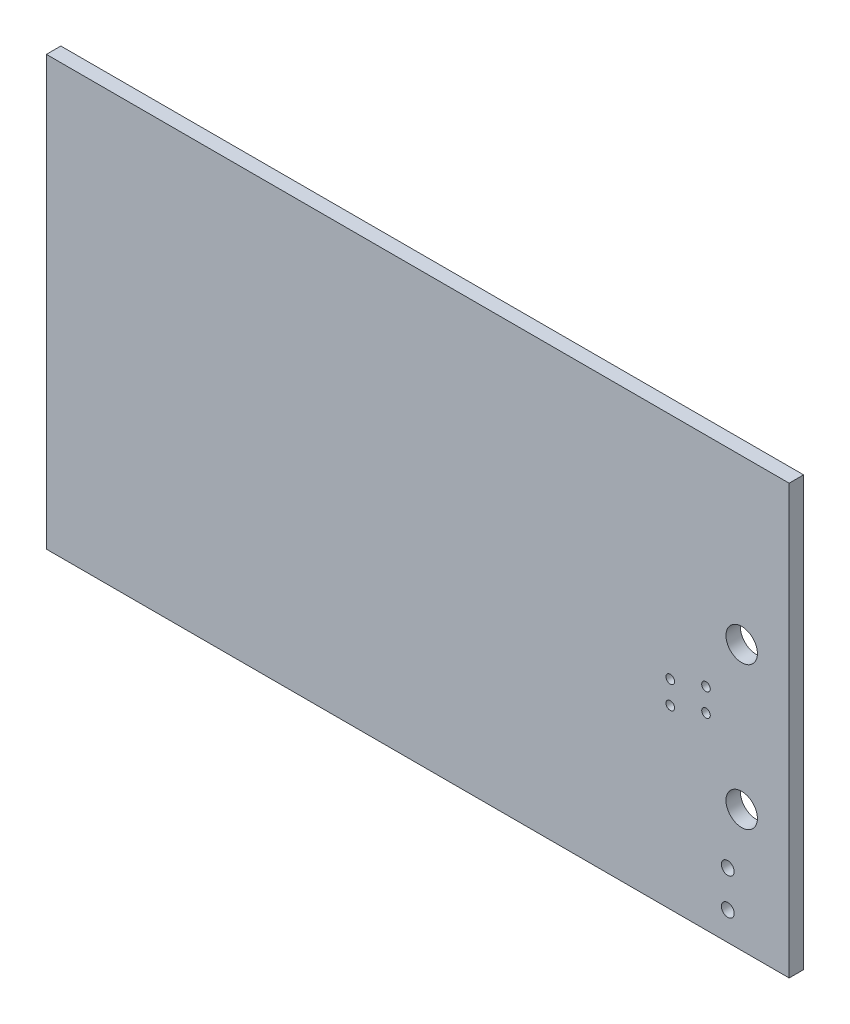
ISO-10303-21;
HEADER;
FILE_DESCRIPTION(('STEP AP214'),'2;1');
FILE_NAME('part.step','',(''),(''),'','','');
FILE_SCHEMA(('AUTOMOTIVE_DESIGN { 1 0 10303 214 1 1 1 1 }'));
ENDSEC;
DATA;
#1=APPLICATION_CONTEXT('core data for automotive mechanical design processes');
#2=APPLICATION_PROTOCOL_DEFINITION('international standard','automotive_design',2000,#1);
#3=PRODUCT_CONTEXT('',#1,'mechanical');
#4=PRODUCT('Part','Part','',(#3));
#5=PRODUCT_RELATED_PRODUCT_CATEGORY('part','',(#4));
#6=PRODUCT_DEFINITION_FORMATION('','',#4);
#7=PRODUCT_DEFINITION_CONTEXT('part definition',#1,'design');
#8=PRODUCT_DEFINITION('design','',#6,#7);
#9=PRODUCT_DEFINITION_SHAPE('','',#8);
#10=(LENGTH_UNIT() NAMED_UNIT(*) SI_UNIT(.MILLI.,.METRE.));
#11=(NAMED_UNIT(*) PLANE_ANGLE_UNIT() SI_UNIT($,.RADIAN.));
#12=(NAMED_UNIT(*) SI_UNIT($,.STERADIAN.) SOLID_ANGLE_UNIT());
#13=UNCERTAINTY_MEASURE_WITH_UNIT(LENGTH_MEASURE(1.E-05),#10,'distance_accuracy_value','');
#14=(GEOMETRIC_REPRESENTATION_CONTEXT(3) GLOBAL_UNCERTAINTY_ASSIGNED_CONTEXT((#13)) GLOBAL_UNIT_ASSIGNED_CONTEXT((#10,
#11,#12)) REPRESENTATION_CONTEXT('',''));
#15=CARTESIAN_POINT('',(0.,0.,0.));
#16=DIRECTION('',(0.,0.,1.));
#17=DIRECTION('',(1.,0.,0.));
#18=AXIS2_PLACEMENT_3D('',#15,#16,#17);
#19=CARTESIAN_POINT('',(100.,100.,0.));
#20=DIRECTION('',(0.,1.,0.));
#21=DIRECTION('',(1.,0.,0.));
#22=AXIS2_PLACEMENT_3D('',#19,#20,#21);
#23=PLANE('',#22);
#24=DIRECTION('',(1.,0.,0.));
#25=VECTOR('',#24,1.);
#26=CARTESIAN_POINT('',(100.,100.,1.0114407));
#27=LINE('',#26,#25);
#28=CARTESIAN_POINT('',(100.,100.,1.0114407));
#29=VERTEX_POINT('',#28);
#30=CARTESIAN_POINT('',(152.,100.,1.0114407));
#31=VERTEX_POINT('',#30);
#32=EDGE_CURVE('E11',#29,#31,#27,.T.);
#33=ORIENTED_EDGE('',*,*,#32,.F.);
#34=DIRECTION('',(0.,0.,1.));
#35=VECTOR('',#34,1.);
#36=CARTESIAN_POINT('',(100.,100.,0.));
#37=LINE('',#36,#35);
#38=CARTESIAN_POINT('',(100.,100.,0.));
#39=VERTEX_POINT('',#38);
#40=EDGE_CURVE('E24',#39,#29,#37,.T.);
#41=ORIENTED_EDGE('',*,*,#40,.F.);
#42=DIRECTION('',(1.,0.,0.));
#43=VECTOR('',#42,1.);
#44=CARTESIAN_POINT('',(100.,100.,0.));
#45=LINE('',#44,#43);
#46=CARTESIAN_POINT('',(152.,100.,0.));
#47=VERTEX_POINT('',#46);
#48=EDGE_CURVE('E194',#39,#47,#45,.T.);
#49=ORIENTED_EDGE('',*,*,#48,.T.);
#50=DIRECTION('',(0.,0.,1.));
#51=VECTOR('',#50,1.);
#52=CARTESIAN_POINT('',(152.,100.,0.));
#53=LINE('',#52,#51);
#54=EDGE_CURVE('E37',#47,#31,#53,.T.);
#55=ORIENTED_EDGE('',*,*,#54,.T.);
#56=EDGE_LOOP('',(#33,#41,#49,#55));
#57=FACE_BOUND('',#56,.T.);
#58=ADVANCED_FACE('F17',(#57),#23,.F.);
#59=CARTESIAN_POINT('',(152.,100.,0.));
#60=DIRECTION('',(-1.,0.,0.));
#61=DIRECTION('',(0.,1.,0.));
#62=AXIS2_PLACEMENT_3D('',#59,#60,#61);
#63=PLANE('',#62);
#64=DIRECTION('',(0.,1.,0.));
#65=VECTOR('',#64,1.);
#66=CARTESIAN_POINT('',(152.,100.,1.0114407));
#67=LINE('',#66,#65);
#68=CARTESIAN_POINT('',(152.,130.,1.0114407));
#69=VERTEX_POINT('',#68);
#70=EDGE_CURVE('E190',#31,#69,#67,.T.);
#71=ORIENTED_EDGE('',*,*,#70,.F.);
#72=ORIENTED_EDGE('',*,*,#54,.F.);
#73=DIRECTION('',(0.,1.,0.));
#74=VECTOR('',#73,1.);
#75=CARTESIAN_POINT('',(152.,100.,0.));
#76=LINE('',#75,#74);
#77=CARTESIAN_POINT('',(152.,130.,0.));
#78=VERTEX_POINT('',#77);
#79=EDGE_CURVE('E187',#47,#78,#76,.T.);
#80=ORIENTED_EDGE('',*,*,#79,.T.);
#81=DIRECTION('',(0.,0.,1.));
#82=VECTOR('',#81,1.);
#83=CARTESIAN_POINT('',(152.,130.,0.));
#84=LINE('',#83,#82);
#85=EDGE_CURVE('E185',#78,#69,#84,.T.);
#86=ORIENTED_EDGE('',*,*,#85,.T.);
#87=EDGE_LOOP('',(#71,#72,#80,#86));
#88=FACE_BOUND('',#87,.T.);
#89=ADVANCED_FACE('F203',(#88),#63,.F.);
#90=CARTESIAN_POINT('',(152.,130.,0.));
#91=DIRECTION('',(0.,-1.,0.));
#92=DIRECTION('',(-1.,0.,0.));
#93=AXIS2_PLACEMENT_3D('',#90,#91,#92);
#94=PLANE('',#93);
#95=DIRECTION('',(-1.,0.,0.));
#96=VECTOR('',#95,1.);
#97=CARTESIAN_POINT('',(152.,130.,1.0114407));
#98=LINE('',#97,#96);
#99=CARTESIAN_POINT('',(100.,130.,1.0114407));
#100=VERTEX_POINT('',#99);
#101=EDGE_CURVE('E182',#69,#100,#98,.T.);
#102=ORIENTED_EDGE('',*,*,#101,.F.);
#103=ORIENTED_EDGE('',*,*,#85,.F.);
#104=DIRECTION('',(-1.,0.,0.));
#105=VECTOR('',#104,1.);
#106=CARTESIAN_POINT('',(152.,130.,0.));
#107=LINE('',#106,#105);
#108=CARTESIAN_POINT('',(100.,130.,0.));
#109=VERTEX_POINT('',#108);
#110=EDGE_CURVE('E179',#78,#109,#107,.T.);
#111=ORIENTED_EDGE('',*,*,#110,.T.);
#112=DIRECTION('',(0.,0.,1.));
#113=VECTOR('',#112,1.);
#114=CARTESIAN_POINT('',(100.,130.,0.));
#115=LINE('',#114,#113);
#116=EDGE_CURVE('E177',#109,#100,#115,.T.);
#117=ORIENTED_EDGE('',*,*,#116,.T.);
#118=EDGE_LOOP('',(#102,#103,#111,#117));
#119=FACE_BOUND('',#118,.T.);
#120=ADVANCED_FACE('F209',(#119),#94,.F.);
#121=CARTESIAN_POINT('',(100.,130.,0.));
#122=DIRECTION('',(1.,0.,0.));
#123=DIRECTION('',(0.,-1.,0.));
#124=AXIS2_PLACEMENT_3D('',#121,#122,#123);
#125=PLANE('',#124);
#126=DIRECTION('',(0.,-1.,0.));
#127=VECTOR('',#126,1.);
#128=CARTESIAN_POINT('',(100.,130.,1.0114407));
#129=LINE('',#128,#127);
#130=EDGE_CURVE('E174',#100,#29,#129,.T.);
#131=ORIENTED_EDGE('',*,*,#130,.F.);
#132=ORIENTED_EDGE('',*,*,#116,.F.);
#133=DIRECTION('',(0.,-1.,0.));
#134=VECTOR('',#133,1.);
#135=CARTESIAN_POINT('',(100.,130.,0.));
#136=LINE('',#135,#134);
#137=EDGE_CURVE('E172',#109,#39,#136,.T.);
#138=ORIENTED_EDGE('',*,*,#137,.T.);
#139=ORIENTED_EDGE('',*,*,#40,.T.);
#140=EDGE_LOOP('',(#131,#132,#138,#139));
#141=FACE_BOUND('',#140,.T.);
#142=ADVANCED_FACE('F210',(#141),#125,.F.);
#143=CARTESIAN_POINT('',(143.67699992,112.35699906,0.));
#144=DIRECTION('',(0.,0.,-1.));
#145=DIRECTION('',(1.,0.,0.));
#146=AXIS2_PLACEMENT_3D('',#143,#144,#145);
#147=CYLINDRICAL_SURFACE('',#146,0.2999994);
#148=DIRECTION('',(0.,0.,1.));
#149=VECTOR('',#148,1.);
#150=CARTESIAN_POINT('',(143.97699932,112.35699906,0.));
#151=LINE('',#150,#149);
#152=CARTESIAN_POINT('',(143.97699932,112.35699906,0.));
#153=VERTEX_POINT('',#152);
#154=CARTESIAN_POINT('',(143.97699932,112.35699906,1.0114407));
#155=VERTEX_POINT('',#154);
#156=EDGE_CURVE('E170',#153,#155,#151,.T.);
#157=ORIENTED_EDGE('',*,*,#156,.T.);
#158=CARTESIAN_POINT('',(143.67699992,112.35699906,1.0114407));
#159=DIRECTION('',(0.,0.,1.));
#160=DIRECTION('',(1.,0.,0.));
#161=AXIS2_PLACEMENT_3D('',#158,#159,#160);
#162=CIRCLE('',#161,0.2999994);
#163=EDGE_CURVE('E167',#155,#155,#162,.T.);
#164=ORIENTED_EDGE('',*,*,#163,.T.);
#165=ORIENTED_EDGE('',*,*,#156,.F.);
#166=CARTESIAN_POINT('',(143.67699992,112.35699906,0.));
#167=DIRECTION('',(0.,0.,1.));
#168=DIRECTION('',(1.,0.,0.));
#169=AXIS2_PLACEMENT_3D('',#166,#167,#168);
#170=CIRCLE('',#169,0.2999994);
#171=EDGE_CURVE('E164',#153,#153,#170,.T.);
#172=ORIENTED_EDGE('',*,*,#171,.F.);
#173=EDGE_LOOP('',(#157,#164,#165,#172));
#174=FACE_BOUND('',#173,.T.);
#175=ADVANCED_FACE('F212',(#174),#147,.F.);
#176=CARTESIAN_POINT('',(146.177,113.157,0.));
#177=DIRECTION('',(0.,0.,-1.));
#178=DIRECTION('',(1.,0.,0.));
#179=AXIS2_PLACEMENT_3D('',#176,#177,#178);
#180=CYLINDRICAL_SURFACE('',#179,0.2999994);
#181=DIRECTION('',(0.,0.,1.));
#182=VECTOR('',#181,1.);
#183=CARTESIAN_POINT('',(146.4769994,113.157,0.));
#184=LINE('',#183,#182);
#185=CARTESIAN_POINT('',(146.4769994,113.157,0.));
#186=VERTEX_POINT('',#185);
#187=CARTESIAN_POINT('',(146.4769994,113.157,1.0114407));
#188=VERTEX_POINT('',#187);
#189=EDGE_CURVE('E162',#186,#188,#184,.T.);
#190=ORIENTED_EDGE('',*,*,#189,.T.);
#191=CARTESIAN_POINT('',(146.177,113.157,1.0114407));
#192=DIRECTION('',(0.,0.,1.));
#193=DIRECTION('',(1.,0.,0.));
#194=AXIS2_PLACEMENT_3D('',#191,#192,#193);
#195=CIRCLE('',#194,0.2999994);
#196=EDGE_CURVE('E159',#188,#188,#195,.T.);
#197=ORIENTED_EDGE('',*,*,#196,.T.);
#198=ORIENTED_EDGE('',*,*,#189,.F.);
#199=CARTESIAN_POINT('',(146.177,113.157,0.));
#200=DIRECTION('',(0.,0.,1.));
#201=DIRECTION('',(1.,0.,0.));
#202=AXIS2_PLACEMENT_3D('',#199,#200,#201);
#203=CIRCLE('',#202,0.2999994);
#204=EDGE_CURVE('E156',#186,#186,#203,.T.);
#205=ORIENTED_EDGE('',*,*,#204,.F.);
#206=EDGE_LOOP('',(#190,#197,#198,#205));
#207=FACE_BOUND('',#206,.T.);
#208=ADVANCED_FACE('F219',(#207),#180,.F.);
#209=CARTESIAN_POINT('',(143.67699992,113.9569984,0.));
#210=DIRECTION('',(0.,0.,-1.));
#211=DIRECTION('',(1.,0.,0.));
#212=AXIS2_PLACEMENT_3D('',#209,#210,#211);
#213=CYLINDRICAL_SURFACE('',#212,0.2999994);
#214=DIRECTION('',(0.,0.,1.));
#215=VECTOR('',#214,1.);
#216=CARTESIAN_POINT('',(143.97699932,113.9569984,0.));
#217=LINE('',#216,#215);
#218=CARTESIAN_POINT('',(143.97699932,113.9569984,0.));
#219=VERTEX_POINT('',#218);
#220=CARTESIAN_POINT('',(143.97699932,113.9569984,1.0114407));
#221=VERTEX_POINT('',#220);
#222=EDGE_CURVE('E154',#219,#221,#217,.T.);
#223=ORIENTED_EDGE('',*,*,#222,.T.);
#224=CARTESIAN_POINT('',(143.67699992,113.9569984,1.0114407));
#225=DIRECTION('',(0.,0.,1.));
#226=DIRECTION('',(1.,0.,0.));
#227=AXIS2_PLACEMENT_3D('',#224,#225,#226);
#228=CIRCLE('',#227,0.2999994);
#229=EDGE_CURVE('E151',#221,#221,#228,.T.);
#230=ORIENTED_EDGE('',*,*,#229,.T.);
#231=ORIENTED_EDGE('',*,*,#222,.F.);
#232=CARTESIAN_POINT('',(143.67699992,113.9569984,0.));
#233=DIRECTION('',(0.,0.,1.));
#234=DIRECTION('',(1.,0.,0.));
#235=AXIS2_PLACEMENT_3D('',#232,#233,#234);
#236=CIRCLE('',#235,0.2999994);
#237=EDGE_CURVE('E148',#219,#219,#236,.T.);
#238=ORIENTED_EDGE('',*,*,#237,.F.);
#239=EDGE_LOOP('',(#223,#230,#231,#238));
#240=FACE_BOUND('',#239,.T.);
#241=ADVANCED_FACE('F257',(#240),#213,.F.);
#242=CARTESIAN_POINT('',(146.177,114.75699934,0.));
#243=DIRECTION('',(0.,0.,-1.));
#244=DIRECTION('',(1.,0.,0.));
#245=AXIS2_PLACEMENT_3D('',#242,#243,#244);
#246=CYLINDRICAL_SURFACE('',#245,0.2999994);
#247=DIRECTION('',(0.,0.,1.));
#248=VECTOR('',#247,1.);
#249=CARTESIAN_POINT('',(146.4769994,114.75699934,0.));
#250=LINE('',#249,#248);
#251=CARTESIAN_POINT('',(146.4769994,114.75699934,0.));
#252=VERTEX_POINT('',#251);
#253=CARTESIAN_POINT('',(146.4769994,114.75699934,1.0114407));
#254=VERTEX_POINT('',#253);
#255=EDGE_CURVE('E146',#252,#254,#250,.T.);
#256=ORIENTED_EDGE('',*,*,#255,.T.);
#257=CARTESIAN_POINT('',(146.177,114.75699934,1.0114407));
#258=DIRECTION('',(0.,0.,1.));
#259=DIRECTION('',(1.,0.,0.));
#260=AXIS2_PLACEMENT_3D('',#257,#258,#259);
#261=CIRCLE('',#260,0.2999994);
#262=EDGE_CURVE('E143',#254,#254,#261,.T.);
#263=ORIENTED_EDGE('',*,*,#262,.T.);
#264=ORIENTED_EDGE('',*,*,#255,.F.);
#265=CARTESIAN_POINT('',(146.177,114.75699934,0.));
#266=DIRECTION('',(0.,0.,1.));
#267=DIRECTION('',(1.,0.,0.));
#268=AXIS2_PLACEMENT_3D('',#265,#266,#267);
#269=CIRCLE('',#268,0.2999994);
#270=EDGE_CURVE('E140',#252,#252,#269,.T.);
#271=ORIENTED_EDGE('',*,*,#270,.F.);
#272=EDGE_LOOP('',(#256,#263,#264,#271));
#273=FACE_BOUND('',#272,.T.);
#274=ADVANCED_FACE('F267',(#273),#246,.F.);
#275=CARTESIAN_POINT('',(147.701,104.521,0.));
#276=DIRECTION('',(0.,0.,-1.));
#277=DIRECTION('',(1.,0.,0.));
#278=AXIS2_PLACEMENT_3D('',#275,#276,#277);
#279=CYLINDRICAL_SURFACE('',#278,0.4499991);
#280=DIRECTION('',(0.,0.,1.));
#281=VECTOR('',#280,1.);
#282=CARTESIAN_POINT('',(148.1509991,104.521,0.));
#283=LINE('',#282,#281);
#284=CARTESIAN_POINT('',(148.1509991,104.521,0.));
#285=VERTEX_POINT('',#284);
#286=CARTESIAN_POINT('',(148.1509991,104.521,1.0114407));
#287=VERTEX_POINT('',#286);
#288=EDGE_CURVE('E138',#285,#287,#283,.T.);
#289=ORIENTED_EDGE('',*,*,#288,.T.);
#290=CARTESIAN_POINT('',(147.701,104.521,1.0114407));
#291=DIRECTION('',(0.,0.,1.));
#292=DIRECTION('',(1.,0.,0.));
#293=AXIS2_PLACEMENT_3D('',#290,#291,#292);
#294=CIRCLE('',#293,0.4499991);
#295=EDGE_CURVE('E135',#287,#287,#294,.T.);
#296=ORIENTED_EDGE('',*,*,#295,.T.);
#297=ORIENTED_EDGE('',*,*,#288,.F.);
#298=CARTESIAN_POINT('',(147.701,104.521,0.));
#299=DIRECTION('',(0.,0.,1.));
#300=DIRECTION('',(1.,0.,0.));
#301=AXIS2_PLACEMENT_3D('',#298,#299,#300);
#302=CIRCLE('',#301,0.4499991);
#303=EDGE_CURVE('E132',#285,#285,#302,.T.);
#304=ORIENTED_EDGE('',*,*,#303,.F.);
#305=EDGE_LOOP('',(#289,#296,#297,#304));
#306=FACE_BOUND('',#305,.T.);
#307=ADVANCED_FACE('F277',(#306),#279,.F.);
#308=CARTESIAN_POINT('',(147.701,101.981,0.));
#309=DIRECTION('',(0.,0.,-1.));
#310=DIRECTION('',(1.,0.,0.));
#311=AXIS2_PLACEMENT_3D('',#308,#309,#310);
#312=CYLINDRICAL_SURFACE('',#311,0.4499991);
#313=DIRECTION('',(0.,0.,1.));
#314=VECTOR('',#313,1.);
#315=CARTESIAN_POINT('',(148.1509991,101.981,0.));
#316=LINE('',#315,#314);
#317=CARTESIAN_POINT('',(148.1509991,101.981,0.));
#318=VERTEX_POINT('',#317);
#319=CARTESIAN_POINT('',(148.1509991,101.981,1.0114407));
#320=VERTEX_POINT('',#319);
#321=EDGE_CURVE('E130',#318,#320,#316,.T.);
#322=ORIENTED_EDGE('',*,*,#321,.T.);
#323=CARTESIAN_POINT('',(147.701,101.981,1.0114407));
#324=DIRECTION('',(0.,0.,1.));
#325=DIRECTION('',(1.,0.,0.));
#326=AXIS2_PLACEMENT_3D('',#323,#324,#325);
#327=CIRCLE('',#326,0.4499991);
#328=EDGE_CURVE('E127',#320,#320,#327,.T.);
#329=ORIENTED_EDGE('',*,*,#328,.T.);
#330=ORIENTED_EDGE('',*,*,#321,.F.);
#331=CARTESIAN_POINT('',(147.701,101.981,0.));
#332=DIRECTION('',(0.,0.,1.));
#333=DIRECTION('',(1.,0.,0.));
#334=AXIS2_PLACEMENT_3D('',#331,#332,#333);
#335=CIRCLE('',#334,0.4499991);
#336=EDGE_CURVE('E124',#318,#318,#335,.T.);
#337=ORIENTED_EDGE('',*,*,#336,.F.);
#338=EDGE_LOOP('',(#322,#329,#330,#337));
#339=FACE_BOUND('',#338,.T.);
#340=ADVANCED_FACE('F287',(#339),#312,.F.);
#341=CARTESIAN_POINT('',(148.67700008,118.55699936,0.));
#342=DIRECTION('',(0.,0.,-1.));
#343=DIRECTION('',(1.,0.,0.));
#344=AXIS2_PLACEMENT_3D('',#341,#342,#343);
#345=CYLINDRICAL_SURFACE('',#344,1.10000034);
#346=DIRECTION('',(0.,0.,1.));
#347=VECTOR('',#346,1.);
#348=CARTESIAN_POINT('',(149.77700042,118.55699936,0.));
#349=LINE('',#348,#347);
#350=CARTESIAN_POINT('',(149.77700042,118.55699936,0.));
#351=VERTEX_POINT('',#350);
#352=CARTESIAN_POINT('',(149.77700042,118.55699936,1.0114407));
#353=VERTEX_POINT('',#352);
#354=EDGE_CURVE('E122',#351,#353,#349,.T.);
#355=ORIENTED_EDGE('',*,*,#354,.T.);
#356=CARTESIAN_POINT('',(148.67700008,118.55699936,1.0114407));
#357=DIRECTION('',(0.,0.,1.));
#358=DIRECTION('',(1.,0.,0.));
#359=AXIS2_PLACEMENT_3D('',#356,#357,#358);
#360=CIRCLE('',#359,1.10000034);
#361=EDGE_CURVE('E119',#353,#353,#360,.T.);
#362=ORIENTED_EDGE('',*,*,#361,.T.);
#363=ORIENTED_EDGE('',*,*,#354,.F.);
#364=CARTESIAN_POINT('',(148.67700008,118.55699936,0.));
#365=DIRECTION('',(0.,0.,1.));
#366=DIRECTION('',(1.,0.,0.));
#367=AXIS2_PLACEMENT_3D('',#364,#365,#366);
#368=CIRCLE('',#367,1.10000034);
#369=EDGE_CURVE('E110',#351,#351,#368,.T.);
#370=ORIENTED_EDGE('',*,*,#369,.F.);
#371=EDGE_LOOP('',(#355,#362,#363,#370));
#372=FACE_BOUND('',#371,.T.);
#373=ADVANCED_FACE('F297',(#372),#345,.F.);
#374=CARTESIAN_POINT('',(148.67700008,108.55699904,0.));
#375=DIRECTION('',(0.,0.,-1.));
#376=DIRECTION('',(1.,0.,0.));
#377=AXIS2_PLACEMENT_3D('',#374,#375,#376);
#378=CYLINDRICAL_SURFACE('',#377,1.10000034);
#379=DIRECTION('',(0.,0.,1.));
#380=VECTOR('',#379,1.);
#381=CARTESIAN_POINT('',(149.77700042,108.55699904,0.));
#382=LINE('',#381,#380);
#383=CARTESIAN_POINT('',(149.77700042,108.55699904,0.));
#384=VERTEX_POINT('',#383);
#385=CARTESIAN_POINT('',(149.77700042,108.55699904,1.0114407));
#386=VERTEX_POINT('',#385);
#387=EDGE_CURVE('E104',#384,#386,#382,.T.);
#388=ORIENTED_EDGE('',*,*,#387,.T.);
#389=CARTESIAN_POINT('',(148.67700008,108.55699904,1.0114407));
#390=DIRECTION('',(0.,0.,1.));
#391=DIRECTION('',(1.,0.,0.));
#392=AXIS2_PLACEMENT_3D('',#389,#390,#391);
#393=CIRCLE('',#392,1.10000034);
#394=EDGE_CURVE('E109',#386,#386,#393,.T.);
#395=ORIENTED_EDGE('',*,*,#394,.T.);
#396=ORIENTED_EDGE('',*,*,#387,.F.);
#397=CARTESIAN_POINT('',(148.67700008,108.55699904,0.));
#398=DIRECTION('',(0.,0.,1.));
#399=DIRECTION('',(1.,0.,0.));
#400=AXIS2_PLACEMENT_3D('',#397,#398,#399);
#401=CIRCLE('',#400,1.10000034);
#402=EDGE_CURVE('E107',#384,#384,#401,.T.);
#403=ORIENTED_EDGE('',*,*,#402,.F.);
#404=EDGE_LOOP('',(#388,#395,#396,#403));
#405=FACE_BOUND('',#404,.T.);
#406=ADVANCED_FACE('F106',(#405),#378,.F.);
#407=CARTESIAN_POINT('',(100.,100.,0.));
#408=DIRECTION('',(0.,0.,-1.));
#409=DIRECTION('',(-1.,0.,0.));
#410=AXIS2_PLACEMENT_3D('',#407,#408,#409);
#411=PLANE('',#410);
#412=ORIENTED_EDGE('',*,*,#137,.F.);
#413=ORIENTED_EDGE('',*,*,#110,.F.);
#414=ORIENTED_EDGE('',*,*,#79,.F.);
#415=ORIENTED_EDGE('',*,*,#48,.F.);
#416=EDGE_LOOP('',(#412,#413,#414,#415));
#417=FACE_BOUND('',#416,.T.);
#418=ORIENTED_EDGE('',*,*,#171,.T.);
#419=EDGE_LOOP('',(#418));
#420=FACE_BOUND('',#419,.T.);
#421=ORIENTED_EDGE('',*,*,#204,.T.);
#422=EDGE_LOOP('',(#421));
#423=FACE_BOUND('',#422,.T.);
#424=ORIENTED_EDGE('',*,*,#237,.T.);
#425=EDGE_LOOP('',(#424));
#426=FACE_BOUND('',#425,.T.);
#427=ORIENTED_EDGE('',*,*,#270,.T.);
#428=EDGE_LOOP('',(#427));
#429=FACE_BOUND('',#428,.T.);
#430=ORIENTED_EDGE('',*,*,#303,.T.);
#431=EDGE_LOOP('',(#430));
#432=FACE_BOUND('',#431,.T.);
#433=ORIENTED_EDGE('',*,*,#336,.T.);
#434=EDGE_LOOP('',(#433));
#435=FACE_BOUND('',#434,.T.);
#436=ORIENTED_EDGE('',*,*,#369,.T.);
#437=EDGE_LOOP('',(#436));
#438=FACE_BOUND('',#437,.T.);
#439=ORIENTED_EDGE('',*,*,#402,.T.);
#440=EDGE_LOOP('',(#439));
#441=FACE_BOUND('',#440,.T.);
#442=ADVANCED_FACE('F113',(#417,#420,#423,#426,#429,#432,#435,#438,#441),#411,.T.);
#443=CARTESIAN_POINT('',(100.,100.,1.0114407));
#444=DIRECTION('',(0.,0.,-1.));
#445=DIRECTION('',(-1.,0.,0.));
#446=AXIS2_PLACEMENT_3D('',#443,#444,#445);
#447=PLANE('',#446);
#448=ORIENTED_EDGE('',*,*,#32,.T.);
#449=ORIENTED_EDGE('',*,*,#70,.T.);
#450=ORIENTED_EDGE('',*,*,#101,.T.);
#451=ORIENTED_EDGE('',*,*,#130,.T.);
#452=EDGE_LOOP('',(#448,#449,#450,#451));
#453=FACE_BOUND('',#452,.T.);
#454=ORIENTED_EDGE('',*,*,#163,.F.);
#455=EDGE_LOOP('',(#454));
#456=FACE_BOUND('',#455,.T.);
#457=ORIENTED_EDGE('',*,*,#196,.F.);
#458=EDGE_LOOP('',(#457));
#459=FACE_BOUND('',#458,.T.);
#460=ORIENTED_EDGE('',*,*,#229,.F.);
#461=EDGE_LOOP('',(#460));
#462=FACE_BOUND('',#461,.T.);
#463=ORIENTED_EDGE('',*,*,#262,.F.);
#464=EDGE_LOOP('',(#463));
#465=FACE_BOUND('',#464,.T.);
#466=ORIENTED_EDGE('',*,*,#295,.F.);
#467=EDGE_LOOP('',(#466));
#468=FACE_BOUND('',#467,.T.);
#469=ORIENTED_EDGE('',*,*,#328,.F.);
#470=EDGE_LOOP('',(#469));
#471=FACE_BOUND('',#470,.T.);
#472=ORIENTED_EDGE('',*,*,#361,.F.);
#473=EDGE_LOOP('',(#472));
#474=FACE_BOUND('',#473,.T.);
#475=ORIENTED_EDGE('',*,*,#394,.F.);
#476=EDGE_LOOP('',(#475));
#477=FACE_BOUND('',#476,.T.);
#478=ADVANCED_FACE('F206',(#453,#456,#459,#462,#465,#468,#471,#474,#477),#447,.F.);
#479=CLOSED_SHELL('',(#58,#89,#120,#142,#175,#208,#241,#274,#307,#340,#373,#406,#442,#478));
#480=MANIFOLD_SOLID_BREP('B1',#479);
#481=ADVANCED_BREP_SHAPE_REPRESENTATION('',(#18,#480),#14);
#482=SHAPE_DEFINITION_REPRESENTATION(#9,#481);
ENDSEC;
END-ISO-10303-21;
